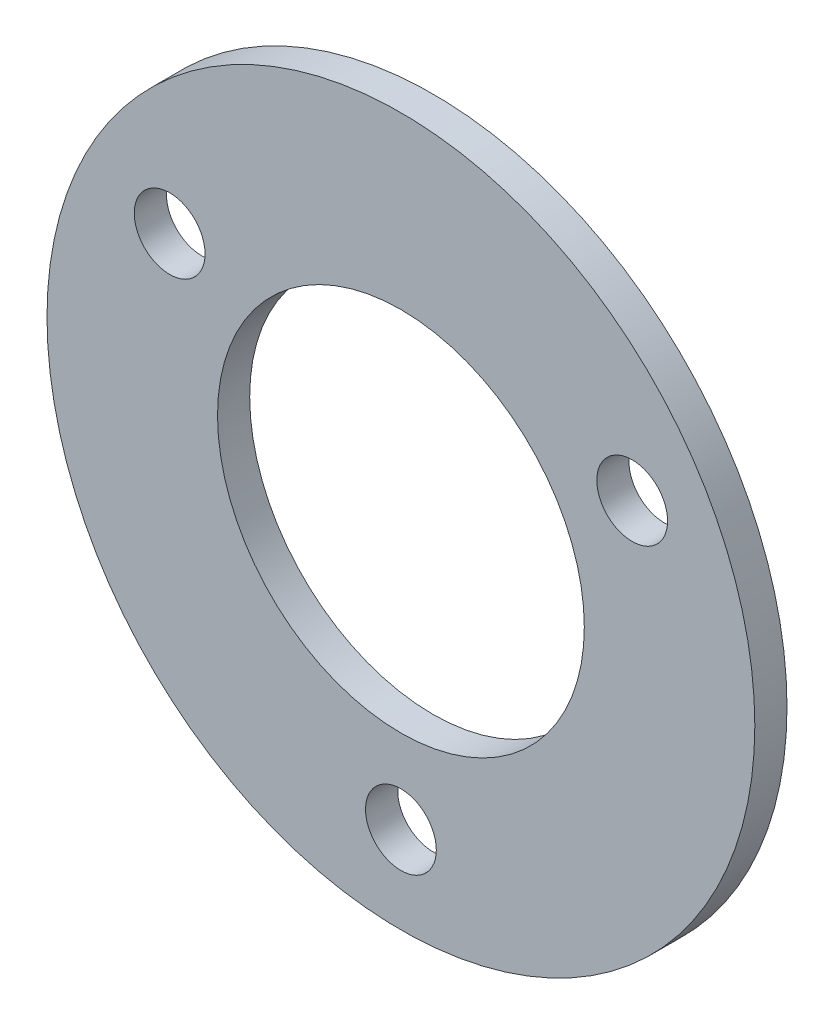
ISO-10303-21;
HEADER;
FILE_DESCRIPTION(('STEP AP214'),'2;1');
FILE_NAME('part.step','',(''),(''),'','','');
FILE_SCHEMA(('AUTOMOTIVE_DESIGN { 1 0 10303 214 1 1 1 1 }'));
ENDSEC;
DATA;
#1=APPLICATION_CONTEXT('core data for automotive mechanical design processes');
#2=APPLICATION_PROTOCOL_DEFINITION('international standard','automotive_design',2000,#1);
#3=PRODUCT_CONTEXT('',#1,'mechanical');
#4=PRODUCT('Part','Part','',(#3));
#5=PRODUCT_RELATED_PRODUCT_CATEGORY('part','',(#4));
#6=PRODUCT_DEFINITION_FORMATION('','',#4);
#7=PRODUCT_DEFINITION_CONTEXT('part definition',#1,'design');
#8=PRODUCT_DEFINITION('design','',#6,#7);
#9=PRODUCT_DEFINITION_SHAPE('','',#8);
#10=(LENGTH_UNIT() NAMED_UNIT(*) SI_UNIT(.MILLI.,.METRE.));
#11=(NAMED_UNIT(*) PLANE_ANGLE_UNIT() SI_UNIT($,.RADIAN.));
#12=(NAMED_UNIT(*) SI_UNIT($,.STERADIAN.) SOLID_ANGLE_UNIT());
#13=UNCERTAINTY_MEASURE_WITH_UNIT(LENGTH_MEASURE(1.E-05),#10,'distance_accuracy_value','');
#14=(GEOMETRIC_REPRESENTATION_CONTEXT(3) GLOBAL_UNCERTAINTY_ASSIGNED_CONTEXT((#13)) GLOBAL_UNIT_ASSIGNED_CONTEXT((#10,
#11,#12)) REPRESENTATION_CONTEXT('',''));
#15=CARTESIAN_POINT('',(0.,0.,0.));
#16=DIRECTION('',(0.,0.,1.));
#17=DIRECTION('',(1.,0.,0.));
#18=AXIS2_PLACEMENT_3D('',#15,#16,#17);
#19=CARTESIAN_POINT('',(0.,0.,1.));
#20=DIRECTION('',(0.,0.,1.));
#21=DIRECTION('',(1.,0.,0.));
#22=AXIS2_PLACEMENT_3D('',#19,#20,#21);
#23=PLANE('',#22);
#24=CARTESIAN_POINT('',(-7.18801085141084,4.15,1.));
#25=DIRECTION('',(0.,0.,1.));
#26=DIRECTION('',(1.,0.,0.));
#27=AXIS2_PLACEMENT_3D('',#24,#25,#26);
#28=CIRCLE('',#27,1.1);
#29=CARTESIAN_POINT('',(-6.08801085141084,4.15,1.));
#30=VERTEX_POINT('',#29);
#31=EDGE_CURVE('E56',#30,#30,#28,.T.);
#32=ORIENTED_EDGE('',*,*,#31,.F.);
#33=EDGE_LOOP('',(#32));
#34=FACE_BOUND('',#33,.T.);
#35=CARTESIAN_POINT('',(0.,0.,1.));
#36=DIRECTION('',(0.,0.,1.));
#37=DIRECTION('',(1.,0.,0.));
#38=AXIS2_PLACEMENT_3D('',#35,#36,#37);
#39=CIRCLE('',#38,5.7);
#40=CARTESIAN_POINT('',(5.7,0.,1.));
#41=VERTEX_POINT('',#40);
#42=EDGE_CURVE('E48',#41,#41,#39,.T.);
#43=ORIENTED_EDGE('',*,*,#42,.F.);
#44=EDGE_LOOP('',(#43));
#45=FACE_BOUND('',#44,.T.);
#46=CARTESIAN_POINT('',(0.,0.,1.));
#47=DIRECTION('',(0.,0.,1.));
#48=DIRECTION('',(1.,0.,0.));
#49=AXIS2_PLACEMENT_3D('',#46,#47,#48);
#50=CIRCLE('',#49,11.);
#51=CARTESIAN_POINT('',(11.,0.,1.));
#52=VERTEX_POINT('',#51);
#53=EDGE_CURVE('E10',#52,#52,#50,.T.);
#54=ORIENTED_EDGE('',*,*,#53,.T.);
#55=EDGE_LOOP('',(#54));
#56=FACE_BOUND('',#55,.T.);
#57=CARTESIAN_POINT('',(7.18801085141084,4.15,1.));
#58=DIRECTION('',(0.,0.,1.));
#59=DIRECTION('',(1.,0.,0.));
#60=AXIS2_PLACEMENT_3D('',#57,#58,#59);
#61=CIRCLE('',#60,1.1);
#62=CARTESIAN_POINT('',(8.28801085141084,4.15,1.));
#63=VERTEX_POINT('',#62);
#64=EDGE_CURVE('E52',#63,#63,#61,.T.);
#65=ORIENTED_EDGE('',*,*,#64,.F.);
#66=EDGE_LOOP('',(#65));
#67=FACE_BOUND('',#66,.T.);
#68=CARTESIAN_POINT('',(0.,-8.3,1.));
#69=DIRECTION('',(0.,0.,1.));
#70=DIRECTION('',(1.,0.,0.));
#71=AXIS2_PLACEMENT_3D('',#68,#69,#70);
#72=CIRCLE('',#71,1.1);
#73=CARTESIAN_POINT('',(1.1,-8.3,1.));
#74=VERTEX_POINT('',#73);
#75=EDGE_CURVE('E62',#74,#74,#72,.T.);
#76=ORIENTED_EDGE('',*,*,#75,.F.);
#77=EDGE_LOOP('',(#76));
#78=FACE_BOUND('',#77,.T.);
#79=ADVANCED_FACE('F40',(#34,#45,#56,#67,#78),#23,.T.);
#80=CARTESIAN_POINT('',(0.,0.,0.));
#81=DIRECTION('',(0.,0.,1.));
#82=DIRECTION('',(1.,0.,0.));
#83=AXIS2_PLACEMENT_3D('',#80,#81,#82);
#84=PLANE('',#83);
#85=CARTESIAN_POINT('',(0.,0.,0.));
#86=DIRECTION('',(0.,0.,1.));
#87=DIRECTION('',(1.,0.,0.));
#88=AXIS2_PLACEMENT_3D('',#85,#86,#87);
#89=CIRCLE('',#88,11.);
#90=CARTESIAN_POINT('',(11.,0.,0.));
#91=VERTEX_POINT('',#90);
#92=EDGE_CURVE('E41',#91,#91,#89,.T.);
#93=ORIENTED_EDGE('',*,*,#92,.F.);
#94=EDGE_LOOP('',(#93));
#95=FACE_BOUND('',#94,.T.);
#96=CARTESIAN_POINT('',(0.,0.,0.));
#97=DIRECTION('',(0.,0.,1.));
#98=DIRECTION('',(1.,0.,0.));
#99=AXIS2_PLACEMENT_3D('',#96,#97,#98);
#100=CIRCLE('',#99,5.7);
#101=CARTESIAN_POINT('',(5.7,0.,0.));
#102=VERTEX_POINT('',#101);
#103=EDGE_CURVE('E49',#102,#102,#100,.T.);
#104=ORIENTED_EDGE('',*,*,#103,.T.);
#105=EDGE_LOOP('',(#104));
#106=FACE_BOUND('',#105,.T.);
#107=CARTESIAN_POINT('',(7.18801085141084,4.15,0.));
#108=DIRECTION('',(0.,0.,1.));
#109=DIRECTION('',(1.,0.,0.));
#110=AXIS2_PLACEMENT_3D('',#107,#108,#109);
#111=CIRCLE('',#110,1.1);
#112=CARTESIAN_POINT('',(8.28801085141084,4.15,0.));
#113=VERTEX_POINT('',#112);
#114=EDGE_CURVE('E57',#113,#113,#111,.T.);
#115=ORIENTED_EDGE('',*,*,#114,.T.);
#116=EDGE_LOOP('',(#115));
#117=FACE_BOUND('',#116,.T.);
#118=CARTESIAN_POINT('',(-7.18801085141084,4.15,0.));
#119=DIRECTION('',(0.,0.,1.));
#120=DIRECTION('',(1.,0.,0.));
#121=AXIS2_PLACEMENT_3D('',#118,#119,#120);
#122=CIRCLE('',#121,1.1);
#123=CARTESIAN_POINT('',(-6.08801085141084,4.15,0.));
#124=VERTEX_POINT('',#123);
#125=EDGE_CURVE('E61',#124,#124,#122,.T.);
#126=ORIENTED_EDGE('',*,*,#125,.T.);
#127=EDGE_LOOP('',(#126));
#128=FACE_BOUND('',#127,.T.);
#129=CARTESIAN_POINT('',(0.,-8.3,0.));
#130=DIRECTION('',(0.,0.,1.));
#131=DIRECTION('',(1.,0.,0.));
#132=AXIS2_PLACEMENT_3D('',#129,#130,#131);
#133=CIRCLE('',#132,1.1);
#134=CARTESIAN_POINT('',(1.1,-8.3,0.));
#135=VERTEX_POINT('',#134);
#136=EDGE_CURVE('E68',#135,#135,#133,.T.);
#137=ORIENTED_EDGE('',*,*,#136,.T.);
#138=EDGE_LOOP('',(#137));
#139=FACE_BOUND('',#138,.T.);
#140=ADVANCED_FACE('F76',(#95,#106,#117,#128,#139),#84,.F.);
#141=CARTESIAN_POINT('',(0.,0.,1.));
#142=DIRECTION('',(0.,0.,-1.));
#143=DIRECTION('',(-1.,0.,0.));
#144=AXIS2_PLACEMENT_3D('',#141,#142,#143);
#145=CYLINDRICAL_SURFACE('',#144,11.);
#146=ORIENTED_EDGE('',*,*,#53,.F.);
#147=EDGE_LOOP('',(#146));
#148=FACE_BOUND('',#147,.T.);
#149=ORIENTED_EDGE('',*,*,#92,.T.);
#150=EDGE_LOOP('',(#149));
#151=FACE_BOUND('',#150,.T.);
#152=ADVANCED_FACE('F39',(#148,#151),#145,.T.);
#153=CARTESIAN_POINT('',(0.,0.,1.));
#154=DIRECTION('',(0.,0.,-1.));
#155=DIRECTION('',(-1.,0.,0.));
#156=AXIS2_PLACEMENT_3D('',#153,#154,#155);
#157=CYLINDRICAL_SURFACE('',#156,5.7);
#158=ORIENTED_EDGE('',*,*,#42,.T.);
#159=EDGE_LOOP('',(#158));
#160=FACE_BOUND('',#159,.T.);
#161=ORIENTED_EDGE('',*,*,#103,.F.);
#162=EDGE_LOOP('',(#161));
#163=FACE_BOUND('',#162,.T.);
#164=ADVANCED_FACE('F88',(#160,#163),#157,.F.);
#165=CARTESIAN_POINT('',(7.18801085141084,4.15,1.));
#166=DIRECTION('',(0.,0.,-1.));
#167=DIRECTION('',(-1.,0.,0.));
#168=AXIS2_PLACEMENT_3D('',#165,#166,#167);
#169=CYLINDRICAL_SURFACE('',#168,1.1);
#170=ORIENTED_EDGE('',*,*,#64,.T.);
#171=EDGE_LOOP('',(#170));
#172=FACE_BOUND('',#171,.T.);
#173=ORIENTED_EDGE('',*,*,#114,.F.);
#174=EDGE_LOOP('',(#173));
#175=FACE_BOUND('',#174,.T.);
#176=ADVANCED_FACE('F92',(#172,#175),#169,.F.);
#177=CARTESIAN_POINT('',(-7.18801085141084,4.15,1.));
#178=DIRECTION('',(0.,0.,-1.));
#179=DIRECTION('',(-1.,0.,0.));
#180=AXIS2_PLACEMENT_3D('',#177,#178,#179);
#181=CYLINDRICAL_SURFACE('',#180,1.1);
#182=ORIENTED_EDGE('',*,*,#31,.T.);
#183=EDGE_LOOP('',(#182));
#184=FACE_BOUND('',#183,.T.);
#185=ORIENTED_EDGE('',*,*,#125,.F.);
#186=EDGE_LOOP('',(#185));
#187=FACE_BOUND('',#186,.T.);
#188=ADVANCED_FACE('F93',(#184,#187),#181,.F.);
#189=CARTESIAN_POINT('',(0.,-8.3,1.));
#190=DIRECTION('',(0.,0.,-1.));
#191=DIRECTION('',(-1.,0.,0.));
#192=AXIS2_PLACEMENT_3D('',#189,#190,#191);
#193=CYLINDRICAL_SURFACE('',#192,1.1);
#194=ORIENTED_EDGE('',*,*,#75,.T.);
#195=EDGE_LOOP('',(#194));
#196=FACE_BOUND('',#195,.T.);
#197=ORIENTED_EDGE('',*,*,#136,.F.);
#198=EDGE_LOOP('',(#197));
#199=FACE_BOUND('',#198,.T.);
#200=ADVANCED_FACE('F71',(#196,#199),#193,.F.);
#201=CLOSED_SHELL('',(#79,#140,#152,#164,#176,#188,#200));
#202=MANIFOLD_SOLID_BREP('B2',#201);
#203=ADVANCED_BREP_SHAPE_REPRESENTATION('',(#18,#202),#14);
#204=SHAPE_DEFINITION_REPRESENTATION(#9,#203);
ENDSEC;
END-ISO-10303-21;
